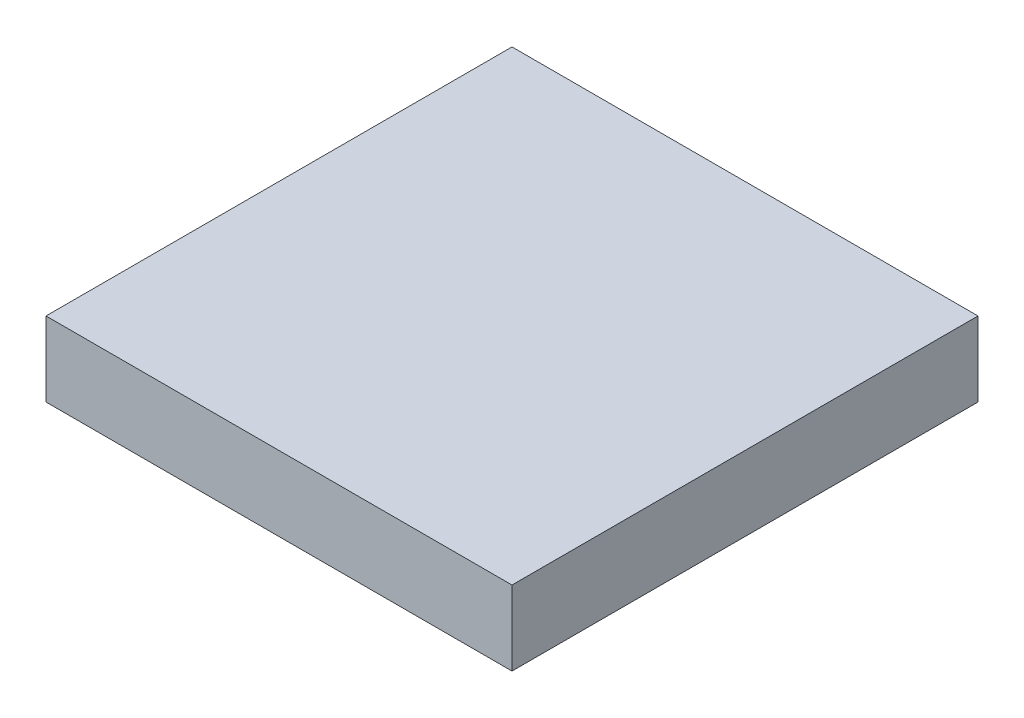
ISO-10303-21;
HEADER;
FILE_DESCRIPTION(('STEP AP214'),'2;1');
FILE_NAME('part.step','',(''),(''),'','','');
FILE_SCHEMA(('AUTOMOTIVE_DESIGN { 1 0 10303 214 1 1 1 1 }'));
ENDSEC;
DATA;
#1=APPLICATION_CONTEXT('core data for automotive mechanical design processes');
#2=APPLICATION_PROTOCOL_DEFINITION('international standard','automotive_design',2000,#1);
#3=PRODUCT_CONTEXT('',#1,'mechanical');
#4=PRODUCT('Part','Part','',(#3));
#5=PRODUCT_RELATED_PRODUCT_CATEGORY('part','',(#4));
#6=PRODUCT_DEFINITION_FORMATION('','',#4);
#7=PRODUCT_DEFINITION_CONTEXT('part definition',#1,'design');
#8=PRODUCT_DEFINITION('design','',#6,#7);
#9=PRODUCT_DEFINITION_SHAPE('','',#8);
#10=(LENGTH_UNIT() NAMED_UNIT(*) SI_UNIT(.MILLI.,.METRE.));
#11=(NAMED_UNIT(*) PLANE_ANGLE_UNIT() SI_UNIT($,.RADIAN.));
#12=(NAMED_UNIT(*) SI_UNIT($,.STERADIAN.) SOLID_ANGLE_UNIT());
#13=UNCERTAINTY_MEASURE_WITH_UNIT(LENGTH_MEASURE(1.E-05),#10,'distance_accuracy_value','');
#14=(GEOMETRIC_REPRESENTATION_CONTEXT(3) GLOBAL_UNCERTAINTY_ASSIGNED_CONTEXT((#13)) GLOBAL_UNIT_ASSIGNED_CONTEXT((#10,
#11,#12)) REPRESENTATION_CONTEXT('',''));
#15=CARTESIAN_POINT('',(0.,0.,0.));
#16=DIRECTION('',(0.,0.,1.));
#17=DIRECTION('',(1.,0.,0.));
#18=AXIS2_PLACEMENT_3D('',#15,#16,#17);
#19=CARTESIAN_POINT('',(0.,1.6,0.));
#20=DIRECTION('',(0.,1.,0.));
#21=DIRECTION('',(0.,0.,1.));
#22=AXIS2_PLACEMENT_3D('',#19,#20,#21);
#23=PLANE('',#22);
#24=DIRECTION('',(-1.,0.,0.));
#25=VECTOR('',#24,1.);
#26=CARTESIAN_POINT('',(5.,1.6,-5.));
#27=LINE('',#26,#25);
#28=CARTESIAN_POINT('',(-5.,1.6,-5.));
#29=VERTEX_POINT('',#28);
#30=CARTESIAN_POINT('',(5.,1.6,-5.));
#31=VERTEX_POINT('',#30);
#32=EDGE_CURVE('E68',#29,#31,#27,.F.);
#33=ORIENTED_EDGE('',*,*,#32,.F.);
#34=DIRECTION('',(0.,0.,1.));
#35=VECTOR('',#34,1.);
#36=CARTESIAN_POINT('',(-5.,1.6,-5.));
#37=LINE('',#36,#35);
#38=CARTESIAN_POINT('',(-5.,1.6,5.));
#39=VERTEX_POINT('',#38);
#40=EDGE_CURVE('E20',#39,#29,#37,.F.);
#41=ORIENTED_EDGE('',*,*,#40,.F.);
#42=DIRECTION('',(1.,0.,0.));
#43=VECTOR('',#42,1.);
#44=CARTESIAN_POINT('',(-5.,1.6,5.));
#45=LINE('',#44,#43);
#46=CARTESIAN_POINT('',(5.,1.6,5.));
#47=VERTEX_POINT('',#46);
#48=EDGE_CURVE('E58',#47,#39,#45,.F.);
#49=ORIENTED_EDGE('',*,*,#48,.F.);
#50=DIRECTION('',(0.,0.,-1.));
#51=VECTOR('',#50,1.);
#52=CARTESIAN_POINT('',(5.,1.6,5.));
#53=LINE('',#52,#51);
#54=EDGE_CURVE('E53',#31,#47,#53,.F.);
#55=ORIENTED_EDGE('',*,*,#54,.F.);
#56=EDGE_LOOP('',(#33,#41,#49,#55));
#57=FACE_BOUND('',#56,.T.);
#58=ADVANCED_FACE('F17',(#57),#23,.T.);
#59=CARTESIAN_POINT('',(-5.,0.,-5.));
#60=DIRECTION('',(-1.,0.,0.));
#61=DIRECTION('',(0.,0.,1.));
#62=AXIS2_PLACEMENT_3D('',#59,#60,#61);
#63=PLANE('',#62);
#64=DIRECTION('',(0.,1.,0.));
#65=VECTOR('',#64,1.);
#66=CARTESIAN_POINT('',(-5.,0.,-5.));
#67=LINE('',#66,#65);
#68=CARTESIAN_POINT('',(-5.,0.,-5.));
#69=VERTEX_POINT('',#68);
#70=EDGE_CURVE('E79',#69,#29,#67,.T.);
#71=ORIENTED_EDGE('',*,*,#70,.F.);
#72=DIRECTION('',(0.,0.,1.));
#73=VECTOR('',#72,1.);
#74=CARTESIAN_POINT('',(-5.,0.,0.));
#75=LINE('',#74,#73);
#76=CARTESIAN_POINT('',(-5.,0.,5.));
#77=VERTEX_POINT('',#76);
#78=EDGE_CURVE('E74',#69,#77,#75,.T.);
#79=ORIENTED_EDGE('',*,*,#78,.T.);
#80=DIRECTION('',(0.,1.,0.));
#81=VECTOR('',#80,1.);
#82=CARTESIAN_POINT('',(-5.,0.,5.));
#83=LINE('',#82,#81);
#84=EDGE_CURVE('E63',#39,#77,#83,.F.);
#85=ORIENTED_EDGE('',*,*,#84,.F.);
#86=ORIENTED_EDGE('',*,*,#40,.T.);
#87=EDGE_LOOP('',(#71,#79,#85,#86));
#88=FACE_BOUND('',#87,.T.);
#89=ADVANCED_FACE('F73',(#88),#63,.T.);
#90=CARTESIAN_POINT('',(-5.,0.,5.));
#91=DIRECTION('',(0.,0.,1.));
#92=DIRECTION('',(1.,0.,0.));
#93=AXIS2_PLACEMENT_3D('',#90,#91,#92);
#94=PLANE('',#93);
#95=ORIENTED_EDGE('',*,*,#84,.T.);
#96=DIRECTION('',(1.,0.,0.));
#97=VECTOR('',#96,1.);
#98=CARTESIAN_POINT('',(0.,0.,5.));
#99=LINE('',#98,#97);
#100=CARTESIAN_POINT('',(5.,0.,5.));
#101=VERTEX_POINT('',#100);
#102=EDGE_CURVE('E84',#77,#101,#99,.T.);
#103=ORIENTED_EDGE('',*,*,#102,.T.);
#104=DIRECTION('',(0.,1.,0.));
#105=VECTOR('',#104,1.);
#106=CARTESIAN_POINT('',(5.,0.,5.));
#107=LINE('',#106,#105);
#108=EDGE_CURVE('E65',#47,#101,#107,.F.);
#109=ORIENTED_EDGE('',*,*,#108,.F.);
#110=ORIENTED_EDGE('',*,*,#48,.T.);
#111=EDGE_LOOP('',(#95,#103,#109,#110));
#112=FACE_BOUND('',#111,.T.);
#113=ADVANCED_FACE('F60',(#112),#94,.T.);
#114=CARTESIAN_POINT('',(5.,0.,5.));
#115=DIRECTION('',(1.,0.,0.));
#116=DIRECTION('',(0.,0.,-1.));
#117=AXIS2_PLACEMENT_3D('',#114,#115,#116);
#118=PLANE('',#117);
#119=ORIENTED_EDGE('',*,*,#108,.T.);
#120=DIRECTION('',(0.,0.,1.));
#121=VECTOR('',#120,1.);
#122=CARTESIAN_POINT('',(5.,0.,0.));
#123=LINE('',#122,#121);
#124=CARTESIAN_POINT('',(5.,0.,-5.));
#125=VERTEX_POINT('',#124);
#126=EDGE_CURVE('E26',#101,#125,#123,.F.);
#127=ORIENTED_EDGE('',*,*,#126,.T.);
#128=DIRECTION('',(0.,1.,0.));
#129=VECTOR('',#128,1.);
#130=CARTESIAN_POINT('',(5.,0.,-5.));
#131=LINE('',#130,#129);
#132=EDGE_CURVE('E34',#31,#125,#131,.F.);
#133=ORIENTED_EDGE('',*,*,#132,.F.);
#134=ORIENTED_EDGE('',*,*,#54,.T.);
#135=EDGE_LOOP('',(#119,#127,#133,#134));
#136=FACE_BOUND('',#135,.T.);
#137=ADVANCED_FACE('F88',(#136),#118,.T.);
#138=CARTESIAN_POINT('',(5.,0.,-5.));
#139=DIRECTION('',(0.,0.,-1.));
#140=DIRECTION('',(-1.,0.,0.));
#141=AXIS2_PLACEMENT_3D('',#138,#139,#140);
#142=PLANE('',#141);
#143=ORIENTED_EDGE('',*,*,#132,.T.);
#144=DIRECTION('',(1.,0.,0.));
#145=VECTOR('',#144,1.);
#146=CARTESIAN_POINT('',(0.,0.,-5.));
#147=LINE('',#146,#145);
#148=EDGE_CURVE('E11',#125,#69,#147,.F.);
#149=ORIENTED_EDGE('',*,*,#148,.T.);
#150=ORIENTED_EDGE('',*,*,#70,.T.);
#151=ORIENTED_EDGE('',*,*,#32,.T.);
#152=EDGE_LOOP('',(#143,#149,#150,#151));
#153=FACE_BOUND('',#152,.T.);
#154=ADVANCED_FACE('F91',(#153),#142,.T.);
#155=CARTESIAN_POINT('',(0.,0.,0.));
#156=DIRECTION('',(0.,1.,0.));
#157=DIRECTION('',(0.,0.,1.));
#158=AXIS2_PLACEMENT_3D('',#155,#156,#157);
#159=PLANE('',#158);
#160=ORIENTED_EDGE('',*,*,#126,.F.);
#161=ORIENTED_EDGE('',*,*,#102,.F.);
#162=ORIENTED_EDGE('',*,*,#78,.F.);
#163=ORIENTED_EDGE('',*,*,#148,.F.);
#164=EDGE_LOOP('',(#160,#161,#162,#163));
#165=FACE_BOUND('',#164,.T.);
#166=ADVANCED_FACE('F90',(#165),#159,.F.);
#167=CLOSED_SHELL('',(#58,#89,#113,#137,#154,#166));
#168=MANIFOLD_SOLID_BREP('B1',#167);
#169=ADVANCED_BREP_SHAPE_REPRESENTATION('',(#18,#168),#14);
#170=SHAPE_DEFINITION_REPRESENTATION(#9,#169);
ENDSEC;
END-ISO-10303-21;
